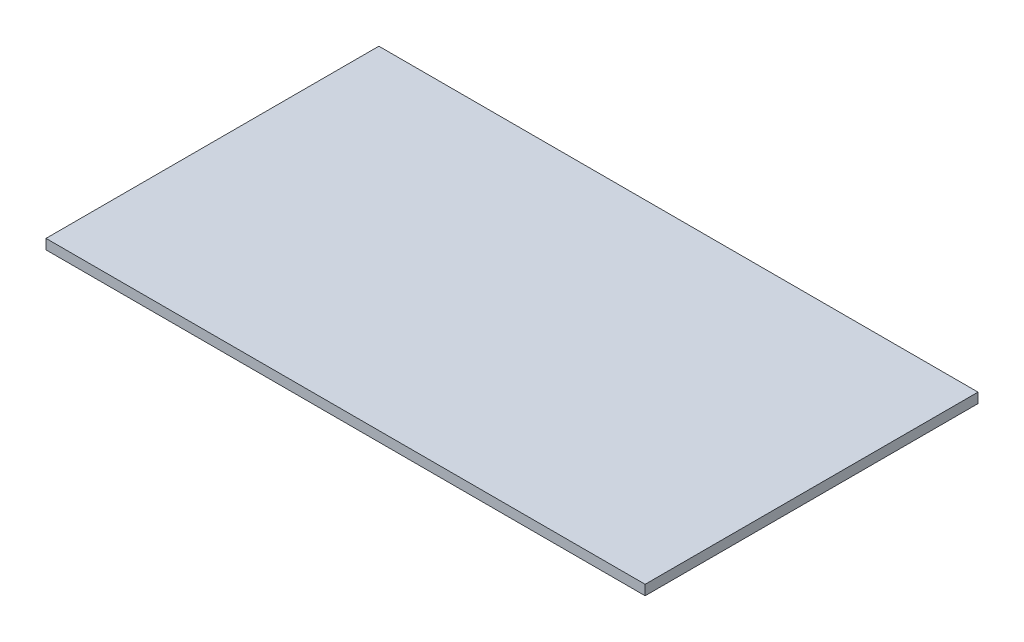
ISO-10303-21;
HEADER;
FILE_DESCRIPTION(('STEP AP214'),'2;1');
FILE_NAME('part.step','',(''),(''),'','','');
FILE_SCHEMA(('AUTOMOTIVE_DESIGN { 1 0 10303 214 1 1 1 1 }'));
ENDSEC;
DATA;
#1=APPLICATION_CONTEXT('core data for automotive mechanical design processes');
#2=APPLICATION_PROTOCOL_DEFINITION('international standard','automotive_design',2000,#1);
#3=PRODUCT_CONTEXT('',#1,'mechanical');
#4=PRODUCT('Part','Part','',(#3));
#5=PRODUCT_RELATED_PRODUCT_CATEGORY('part','',(#4));
#6=PRODUCT_DEFINITION_FORMATION('','',#4);
#7=PRODUCT_DEFINITION_CONTEXT('part definition',#1,'design');
#8=PRODUCT_DEFINITION('design','',#6,#7);
#9=PRODUCT_DEFINITION_SHAPE('','',#8);
#10=(LENGTH_UNIT() NAMED_UNIT(*) SI_UNIT(.MILLI.,.METRE.));
#11=(NAMED_UNIT(*) PLANE_ANGLE_UNIT() SI_UNIT($,.RADIAN.));
#12=(NAMED_UNIT(*) SI_UNIT($,.STERADIAN.) SOLID_ANGLE_UNIT());
#13=UNCERTAINTY_MEASURE_WITH_UNIT(LENGTH_MEASURE(1.E-05),#10,'distance_accuracy_value','');
#14=(GEOMETRIC_REPRESENTATION_CONTEXT(3) GLOBAL_UNCERTAINTY_ASSIGNED_CONTEXT((#13)) GLOBAL_UNIT_ASSIGNED_CONTEXT((#10,
#11,#12)) REPRESENTATION_CONTEXT('',''));
#15=CARTESIAN_POINT('',(0.,0.,0.));
#16=DIRECTION('',(0.,0.,1.));
#17=DIRECTION('',(1.,0.,0.));
#18=AXIS2_PLACEMENT_3D('',#15,#16,#17);
#19=CARTESIAN_POINT('',(540.,18.,300.));
#20=DIRECTION('',(-1.,0.,0.));
#21=DIRECTION('',(0.,0.,1.));
#22=AXIS2_PLACEMENT_3D('',#19,#20,#21);
#23=PLANE('',#22);
#24=DIRECTION('',(0.,0.,-1.));
#25=VECTOR('',#24,1.);
#26=CARTESIAN_POINT('',(540.,0.,300.));
#27=LINE('',#26,#25);
#28=CARTESIAN_POINT('',(540.,0.,300.));
#29=VERTEX_POINT('',#28);
#30=CARTESIAN_POINT('',(540.,0.,-300.));
#31=VERTEX_POINT('',#30);
#32=EDGE_CURVE('E107',#29,#31,#27,.T.);
#33=ORIENTED_EDGE('',*,*,#32,.T.);
#34=DIRECTION('',(0.,-1.,0.));
#35=VECTOR('',#34,1.);
#36=CARTESIAN_POINT('',(540.,18.,-300.));
#37=LINE('',#36,#35);
#38=CARTESIAN_POINT('',(540.,18.,-300.));
#39=VERTEX_POINT('',#38);
#40=EDGE_CURVE('E11',#39,#31,#37,.T.);
#41=ORIENTED_EDGE('',*,*,#40,.F.);
#42=DIRECTION('',(0.,0.,-1.));
#43=VECTOR('',#42,1.);
#44=CARTESIAN_POINT('',(540.,18.,300.));
#45=LINE('',#44,#43);
#46=CARTESIAN_POINT('',(540.,18.,300.));
#47=VERTEX_POINT('',#46);
#48=EDGE_CURVE('E91',#47,#39,#45,.T.);
#49=ORIENTED_EDGE('',*,*,#48,.F.);
#50=DIRECTION('',(0.,-1.,0.));
#51=VECTOR('',#50,1.);
#52=CARTESIAN_POINT('',(540.,18.,300.));
#53=LINE('',#52,#51);
#54=EDGE_CURVE('E103',#47,#29,#53,.T.);
#55=ORIENTED_EDGE('',*,*,#54,.T.);
#56=EDGE_LOOP('',(#33,#41,#49,#55));
#57=FACE_BOUND('',#56,.T.);
#58=ADVANCED_FACE('F39',(#57),#23,.F.);
#59=CARTESIAN_POINT('',(-540.,18.,-300.));
#60=DIRECTION('',(0.,0.,1.));
#61=DIRECTION('',(1.,0.,0.));
#62=AXIS2_PLACEMENT_3D('',#59,#60,#61);
#63=PLANE('',#62);
#64=DIRECTION('',(-1.,0.,0.));
#65=VECTOR('',#64,1.);
#66=CARTESIAN_POINT('',(-540.,0.,-300.));
#67=LINE('',#66,#65);
#68=CARTESIAN_POINT('',(-540.,0.,-300.));
#69=VERTEX_POINT('',#68);
#70=EDGE_CURVE('E96',#31,#69,#67,.T.);
#71=ORIENTED_EDGE('',*,*,#70,.T.);
#72=DIRECTION('',(0.,-1.,0.));
#73=VECTOR('',#72,1.);
#74=CARTESIAN_POINT('',(-540.,18.,-300.));
#75=LINE('',#74,#73);
#76=CARTESIAN_POINT('',(-540.,18.,-300.));
#77=VERTEX_POINT('',#76);
#78=EDGE_CURVE('E48',#77,#69,#75,.T.);
#79=ORIENTED_EDGE('',*,*,#78,.F.);
#80=DIRECTION('',(-1.,0.,0.));
#81=VECTOR('',#80,1.);
#82=CARTESIAN_POINT('',(-540.,18.,-300.));
#83=LINE('',#82,#81);
#84=EDGE_CURVE('E86',#39,#77,#83,.T.);
#85=ORIENTED_EDGE('',*,*,#84,.F.);
#86=ORIENTED_EDGE('',*,*,#40,.T.);
#87=EDGE_LOOP('',(#71,#79,#85,#86));
#88=FACE_BOUND('',#87,.T.);
#89=ADVANCED_FACE('F95',(#88),#63,.F.);
#90=CARTESIAN_POINT('',(-540.,18.,300.));
#91=DIRECTION('',(1.,0.,0.));
#92=DIRECTION('',(0.,0.,-1.));
#93=AXIS2_PLACEMENT_3D('',#90,#91,#92);
#94=PLANE('',#93);
#95=DIRECTION('',(0.,0.,1.));
#96=VECTOR('',#95,1.);
#97=CARTESIAN_POINT('',(-540.,0.,300.));
#98=LINE('',#97,#96);
#99=CARTESIAN_POINT('',(-540.,0.,300.));
#100=VERTEX_POINT('',#99);
#101=EDGE_CURVE('E73',#69,#100,#98,.T.);
#102=ORIENTED_EDGE('',*,*,#101,.T.);
#103=DIRECTION('',(0.,-1.,0.));
#104=VECTOR('',#103,1.);
#105=CARTESIAN_POINT('',(-540.,18.,300.));
#106=LINE('',#105,#104);
#107=CARTESIAN_POINT('',(-540.,18.,300.));
#108=VERTEX_POINT('',#107);
#109=EDGE_CURVE('E98',#108,#100,#106,.T.);
#110=ORIENTED_EDGE('',*,*,#109,.F.);
#111=DIRECTION('',(0.,0.,1.));
#112=VECTOR('',#111,1.);
#113=CARTESIAN_POINT('',(-540.,18.,300.));
#114=LINE('',#113,#112);
#115=EDGE_CURVE('E89',#77,#108,#114,.T.);
#116=ORIENTED_EDGE('',*,*,#115,.F.);
#117=ORIENTED_EDGE('',*,*,#78,.T.);
#118=EDGE_LOOP('',(#102,#110,#116,#117));
#119=FACE_BOUND('',#118,.T.);
#120=ADVANCED_FACE('F99',(#119),#94,.F.);
#121=CARTESIAN_POINT('',(-540.,18.,300.));
#122=DIRECTION('',(0.,0.,-1.));
#123=DIRECTION('',(-1.,0.,0.));
#124=AXIS2_PLACEMENT_3D('',#121,#122,#123);
#125=PLANE('',#124);
#126=DIRECTION('',(1.,0.,0.));
#127=VECTOR('',#126,1.);
#128=CARTESIAN_POINT('',(-540.,0.,300.));
#129=LINE('',#128,#127);
#130=EDGE_CURVE('E79',#100,#29,#129,.T.);
#131=ORIENTED_EDGE('',*,*,#130,.T.);
#132=ORIENTED_EDGE('',*,*,#54,.F.);
#133=DIRECTION('',(1.,0.,0.));
#134=VECTOR('',#133,1.);
#135=CARTESIAN_POINT('',(-540.,18.,300.));
#136=LINE('',#135,#134);
#137=EDGE_CURVE('E56',#108,#47,#136,.T.);
#138=ORIENTED_EDGE('',*,*,#137,.F.);
#139=ORIENTED_EDGE('',*,*,#109,.T.);
#140=EDGE_LOOP('',(#131,#132,#138,#139));
#141=FACE_BOUND('',#140,.T.);
#142=ADVANCED_FACE('F120',(#141),#125,.F.);
#143=CARTESIAN_POINT('',(0.,18.,0.));
#144=DIRECTION('',(0.,-1.,0.));
#145=DIRECTION('',(0.,0.,-1.));
#146=AXIS2_PLACEMENT_3D('',#143,#144,#145);
#147=PLANE('',#146);
#148=ORIENTED_EDGE('',*,*,#48,.T.);
#149=ORIENTED_EDGE('',*,*,#84,.T.);
#150=ORIENTED_EDGE('',*,*,#115,.T.);
#151=ORIENTED_EDGE('',*,*,#137,.T.);
#152=EDGE_LOOP('',(#148,#149,#150,#151));
#153=FACE_BOUND('',#152,.T.);
#154=ADVANCED_FACE('F87',(#153),#147,.F.);
#155=CARTESIAN_POINT('',(0.,0.,0.));
#156=DIRECTION('',(0.,-1.,0.));
#157=DIRECTION('',(0.,0.,-1.));
#158=AXIS2_PLACEMENT_3D('',#155,#156,#157);
#159=PLANE('',#158);
#160=ORIENTED_EDGE('',*,*,#32,.F.);
#161=ORIENTED_EDGE('',*,*,#130,.F.);
#162=ORIENTED_EDGE('',*,*,#101,.F.);
#163=ORIENTED_EDGE('',*,*,#70,.F.);
#164=EDGE_LOOP('',(#160,#161,#162,#163));
#165=FACE_BOUND('',#164,.T.);
#166=ADVANCED_FACE('F123',(#165),#159,.T.);
#167=CLOSED_SHELL('',(#58,#89,#120,#142,#154,#166));
#168=MANIFOLD_SOLID_BREP('B2',#167);
#169=ADVANCED_BREP_SHAPE_REPRESENTATION('',(#18,#168),#14);
#170=SHAPE_DEFINITION_REPRESENTATION(#9,#169);
ENDSEC;
END-ISO-10303-21;
